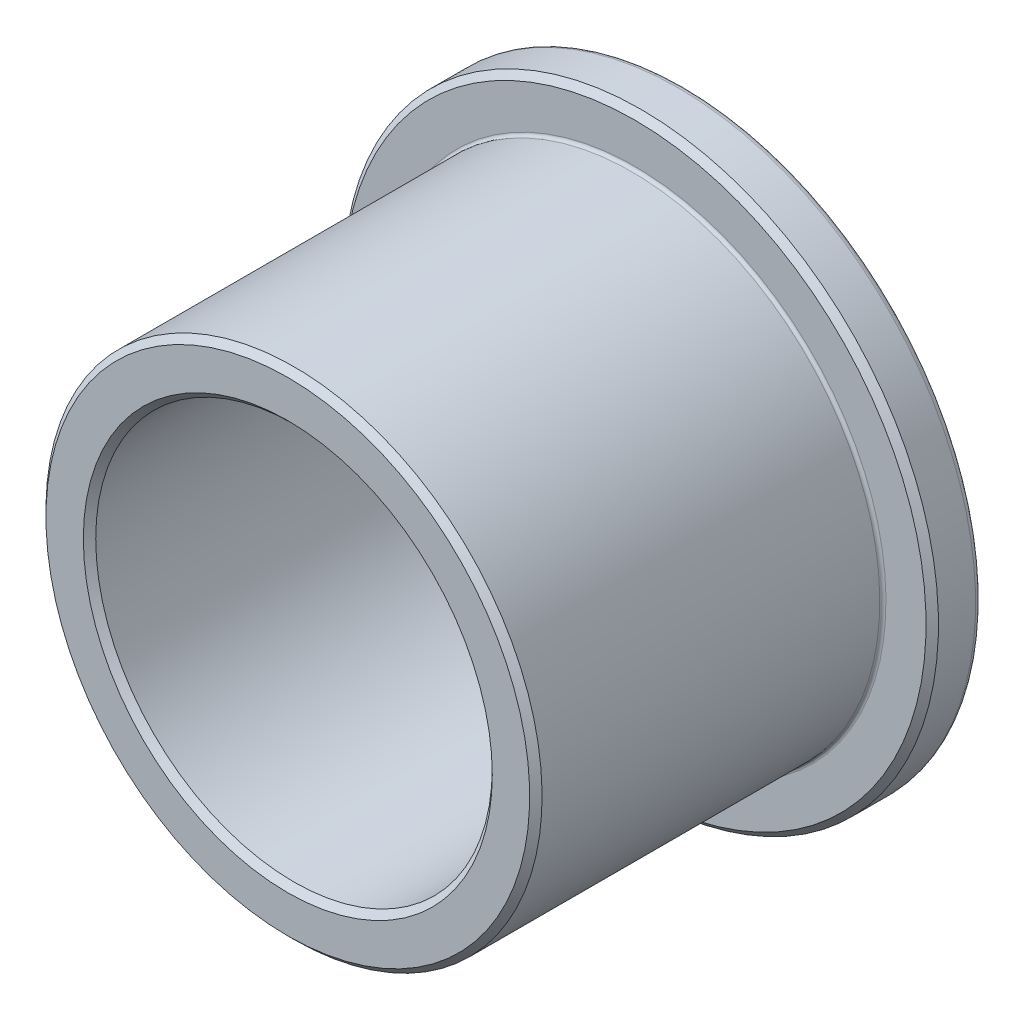
ISO-10303-21;
HEADER;
FILE_DESCRIPTION(('STEP AP214'),'2;1');
FILE_NAME('part.step','',(''),(''),'','','');
FILE_SCHEMA(('AUTOMOTIVE_DESIGN { 1 0 10303 214 1 1 1 1 }'));
ENDSEC;
DATA;
#1=APPLICATION_CONTEXT('core data for automotive mechanical design processes');
#2=APPLICATION_PROTOCOL_DEFINITION('international standard','automotive_design',2000,#1);
#3=PRODUCT_CONTEXT('',#1,'mechanical');
#4=PRODUCT('Part','Part','',(#3));
#5=PRODUCT_RELATED_PRODUCT_CATEGORY('part','',(#4));
#6=PRODUCT_DEFINITION_FORMATION('','',#4);
#7=PRODUCT_DEFINITION_CONTEXT('part definition',#1,'design');
#8=PRODUCT_DEFINITION('design','',#6,#7);
#9=PRODUCT_DEFINITION_SHAPE('','',#8);
#10=(LENGTH_UNIT() NAMED_UNIT(*) SI_UNIT(.MILLI.,.METRE.));
#11=(NAMED_UNIT(*) PLANE_ANGLE_UNIT() SI_UNIT($,.RADIAN.));
#12=(NAMED_UNIT(*) SI_UNIT($,.STERADIAN.) SOLID_ANGLE_UNIT());
#13=UNCERTAINTY_MEASURE_WITH_UNIT(LENGTH_MEASURE(1.E-05),#10,'distance_accuracy_value','');
#14=(GEOMETRIC_REPRESENTATION_CONTEXT(3) GLOBAL_UNCERTAINTY_ASSIGNED_CONTEXT((#13)) GLOBAL_UNIT_ASSIGNED_CONTEXT((#10,
#11,#12)) REPRESENTATION_CONTEXT('',''));
#15=CARTESIAN_POINT('',(0.,0.,0.));
#16=DIRECTION('',(0.,0.,1.));
#17=DIRECTION('',(1.,0.,0.));
#18=AXIS2_PLACEMENT_3D('',#15,#16,#17);
#19=CARTESIAN_POINT('',(0.,19.05,-12.7));
#20=DIRECTION('',(0.,0.,-1.));
#21=DIRECTION('',(0.,1.,0.));
#22=AXIS2_PLACEMENT_3D('',#19,#20,#21);
#23=PLANE('',#22);
#24=CARTESIAN_POINT('',(0.,0.,-12.7));
#25=DIRECTION('',(0.,0.,-1.));
#26=DIRECTION('',(0.,1.,0.));
#27=AXIS2_PLACEMENT_3D('',#24,#25,#26);
#28=CIRCLE('',#27,18.653125);
#29=CARTESIAN_POINT('',(0.,18.653125,-12.7));
#30=VERTEX_POINT('',#29);
#31=EDGE_CURVE('E59',#30,#30,#28,.T.);
#32=ORIENTED_EDGE('',*,*,#31,.T.);
#33=EDGE_LOOP('',(#32));
#34=FACE_BOUND('',#33,.T.);
#35=CARTESIAN_POINT('',(0.,0.,-12.7));
#36=DIRECTION('',(0.,0.,-1.));
#37=DIRECTION('',(0.,1.,0.));
#38=AXIS2_PLACEMENT_3D('',#35,#36,#37);
#39=CIRCLE('',#38,12.7);
#40=CARTESIAN_POINT('',(0.,12.7,-12.7));
#41=VERTEX_POINT('',#40);
#42=EDGE_CURVE('E89',#41,#41,#39,.T.);
#43=ORIENTED_EDGE('',*,*,#42,.F.);
#44=EDGE_LOOP('',(#43));
#45=FACE_BOUND('',#44,.T.);
#46=ADVANCED_FACE('F41',(#34,#45),#23,.T.);
#47=CARTESIAN_POINT('',(0.,0.,-12.7));
#48=DIRECTION('',(0.,0.,-1.));
#49=DIRECTION('',(0.,1.,0.));
#50=AXIS2_PLACEMENT_3D('',#47,#48,#49);
#51=CYLINDRICAL_SURFACE('',#50,19.05);
#52=CARTESIAN_POINT('',(0.,0.,-12.303125));
#53=DIRECTION('',(0.,0.,-1.));
#54=DIRECTION('',(0.,1.,0.));
#55=AXIS2_PLACEMENT_3D('',#52,#53,#54);
#56=CIRCLE('',#55,19.05);
#57=CARTESIAN_POINT('',(0.,19.05,-12.303125));
#58=VERTEX_POINT('',#57);
#59=EDGE_CURVE('E54',#58,#58,#56,.F.);
#60=ORIENTED_EDGE('',*,*,#59,.T.);
#61=EDGE_LOOP('',(#60));
#62=FACE_BOUND('',#61,.T.);
#63=CARTESIAN_POINT('',(0.,0.,-9.921875));
#64=DIRECTION('',(0.,0.,1.));
#65=DIRECTION('',(0.,-1.,0.));
#66=AXIS2_PLACEMENT_3D('',#63,#64,#65);
#67=CIRCLE('',#66,19.05);
#68=CARTESIAN_POINT('',(0.,19.05,-9.921875));
#69=VERTEX_POINT('',#68);
#70=EDGE_CURVE('E85',#69,#69,#67,.F.);
#71=ORIENTED_EDGE('',*,*,#70,.T.);
#72=EDGE_LOOP('',(#71));
#73=FACE_BOUND('',#72,.T.);
#74=ADVANCED_FACE('F97',(#62,#73),#51,.T.);
#75=CARTESIAN_POINT('',(0.,19.05,-9.525));
#76=DIRECTION('',(0.,0.,1.));
#77=DIRECTION('',(0.,-1.,0.));
#78=AXIS2_PLACEMENT_3D('',#75,#76,#77);
#79=PLANE('',#78);
#80=CARTESIAN_POINT('',(0.,0.,-9.525));
#81=DIRECTION('',(0.,0.,1.));
#82=DIRECTION('',(0.,-1.,0.));
#83=AXIS2_PLACEMENT_3D('',#80,#81,#82);
#84=CIRCLE('',#83,16.0861375);
#85=CARTESIAN_POINT('',(0.,-16.0861375,-9.525));
#86=VERTEX_POINT('',#85);
#87=EDGE_CURVE('E49',#86,#86,#84,.F.);
#88=ORIENTED_EDGE('',*,*,#87,.T.);
#89=EDGE_LOOP('',(#88));
#90=FACE_BOUND('',#89,.T.);
#91=CARTESIAN_POINT('',(0.,0.,-9.525));
#92=DIRECTION('',(0.,0.,1.));
#93=DIRECTION('',(0.,-1.,0.));
#94=AXIS2_PLACEMENT_3D('',#91,#92,#93);
#95=CIRCLE('',#94,18.653125);
#96=CARTESIAN_POINT('',(0.,18.653125,-9.525));
#97=VERTEX_POINT('',#96);
#98=EDGE_CURVE('E81',#97,#97,#95,.T.);
#99=ORIENTED_EDGE('',*,*,#98,.T.);
#100=EDGE_LOOP('',(#99));
#101=FACE_BOUND('',#100,.T.);
#102=ADVANCED_FACE('F104',(#90,#101),#79,.T.);
#103=CARTESIAN_POINT('',(0.,0.,-12.7));
#104=DIRECTION('',(0.,0.,-1.));
#105=DIRECTION('',(0.,1.,0.));
#106=AXIS2_PLACEMENT_3D('',#103,#104,#105);
#107=CYLINDRICAL_SURFACE('',#106,15.8877);
#108=CARTESIAN_POINT('',(0.,0.,-9.3265625));
#109=DIRECTION('',(0.,0.,1.));
#110=DIRECTION('',(0.,-1.,0.));
#111=AXIS2_PLACEMENT_3D('',#108,#109,#110);
#112=CIRCLE('',#111,15.8877);
#113=CARTESIAN_POINT('',(0.,-15.8877,-9.3265625));
#114=VERTEX_POINT('',#113);
#115=EDGE_CURVE('E10',#114,#114,#112,.T.);
#116=ORIENTED_EDGE('',*,*,#115,.T.);
#117=EDGE_LOOP('',(#116));
#118=FACE_BOUND('',#117,.T.);
#119=CARTESIAN_POINT('',(0.,0.,12.303125));
#120=DIRECTION('',(0.,0.,1.));
#121=DIRECTION('',(0.,-1.,0.));
#122=AXIS2_PLACEMENT_3D('',#119,#120,#121);
#123=CIRCLE('',#122,15.8877);
#124=CARTESIAN_POINT('',(0.,-15.8877,12.303125));
#125=VERTEX_POINT('',#124);
#126=EDGE_CURVE('E77',#125,#125,#123,.F.);
#127=ORIENTED_EDGE('',*,*,#126,.T.);
#128=EDGE_LOOP('',(#127));
#129=FACE_BOUND('',#128,.T.);
#130=ADVANCED_FACE('F139',(#118,#129),#107,.T.);
#131=CARTESIAN_POINT('',(0.,15.8877,12.7));
#132=DIRECTION('',(0.,0.,1.));
#133=DIRECTION('',(0.,-1.,0.));
#134=AXIS2_PLACEMENT_3D('',#131,#132,#133);
#135=PLANE('',#134);
#136=CARTESIAN_POINT('',(0.,0.,12.7));
#137=DIRECTION('',(0.,0.,1.));
#138=DIRECTION('',(0.,-1.,0.));
#139=AXIS2_PLACEMENT_3D('',#136,#137,#138);
#140=CIRCLE('',#139,15.490825);
#141=CARTESIAN_POINT('',(0.,-15.490825,12.7));
#142=VERTEX_POINT('',#141);
#143=EDGE_CURVE('E69',#142,#142,#140,.T.);
#144=ORIENTED_EDGE('',*,*,#143,.T.);
#145=EDGE_LOOP('',(#144));
#146=FACE_BOUND('',#145,.T.);
#147=CARTESIAN_POINT('',(0.,0.,12.7));
#148=DIRECTION('',(0.,0.,1.));
#149=DIRECTION('',(0.,-1.,0.));
#150=AXIS2_PLACEMENT_3D('',#147,#148,#149);
#151=CIRCLE('',#150,13.096875);
#152=CARTESIAN_POINT('',(0.,-13.096875,12.7));
#153=VERTEX_POINT('',#152);
#154=EDGE_CURVE('E73',#153,#153,#151,.F.);
#155=ORIENTED_EDGE('',*,*,#154,.T.);
#156=EDGE_LOOP('',(#155));
#157=FACE_BOUND('',#156,.T.);
#158=ADVANCED_FACE('F142',(#146,#157),#135,.T.);
#159=CARTESIAN_POINT('',(0.,0.,-12.7));
#160=DIRECTION('',(0.,0.,-1.));
#161=DIRECTION('',(0.,1.,0.));
#162=AXIS2_PLACEMENT_3D('',#159,#160,#161);
#163=CYLINDRICAL_SURFACE('',#162,12.7);
#164=CARTESIAN_POINT('',(0.,0.,12.303125));
#165=DIRECTION('',(0.,0.,1.));
#166=DIRECTION('',(0.,-1.,0.));
#167=AXIS2_PLACEMENT_3D('',#164,#165,#166);
#168=CIRCLE('',#167,12.7);
#169=CARTESIAN_POINT('',(0.,-12.7,12.303125));
#170=VERTEX_POINT('',#169);
#171=EDGE_CURVE('E65',#170,#170,#168,.T.);
#172=ORIENTED_EDGE('',*,*,#171,.T.);
#173=EDGE_LOOP('',(#172));
#174=FACE_BOUND('',#173,.T.);
#175=ORIENTED_EDGE('',*,*,#42,.T.);
#176=EDGE_LOOP('',(#175));
#177=FACE_BOUND('',#176,.T.);
#178=ADVANCED_FACE('F94',(#174,#177),#163,.F.);
#179=CARTESIAN_POINT('',(0.,0.,-9.921875));
#180=DIRECTION('',(0.,0.,-1.));
#181=DIRECTION('',(0.,1.,0.));
#182=AXIS2_PLACEMENT_3D('',#179,#180,#181);
#183=CONICAL_SURFACE('',#182,19.05,0.785398163397453);
#184=CARTESIAN_POINT('',(0.,18.653125,-9.525));
#185=CARTESIAN_POINT('',(0.,18.6572591145833,-9.52913411458333));
#186=CARTESIAN_POINT('',(0.,18.6613932291667,-9.53326822916666));
#187=CARTESIAN_POINT('',(0.,18.6696614583333,-9.54153645833333));
#188=CARTESIAN_POINT('',(0.,18.6737955729167,-9.54567057291666));
#189=CARTESIAN_POINT('',(0.,18.6820638020833,-9.55393880208333));
#190=CARTESIAN_POINT('',(0.,18.6861979166667,-9.55807291666667));
#191=CARTESIAN_POINT('',(0.,18.6944661458333,-9.56634114583333));
#192=CARTESIAN_POINT('',(0.,18.6986002604167,-9.57047526041666));
#193=CARTESIAN_POINT('',(0.,18.7068684895833,-9.57874348958333));
#194=CARTESIAN_POINT('',(0.,18.7110026041667,-9.58287760416667));
#195=CARTESIAN_POINT('',(0.,18.7192708333333,-9.59114583333333));
#196=CARTESIAN_POINT('',(0.,18.7234049479167,-9.59527994791667));
#197=CARTESIAN_POINT('',(0.,18.7316731770833,-9.60354817708333));
#198=CARTESIAN_POINT('',(0.,18.7358072916667,-9.60768229166667));
#199=CARTESIAN_POINT('',(0.,18.7440755208333,-9.61595052083333));
#200=CARTESIAN_POINT('',(0.,18.7482096354167,-9.62008463541667));
#201=CARTESIAN_POINT('',(0.,18.7564778645833,-9.62835286458333));
#202=CARTESIAN_POINT('',(0.,18.7606119791667,-9.63248697916667));
#203=CARTESIAN_POINT('',(0.,18.7688802083333,-9.64075520833333));
#204=CARTESIAN_POINT('',(0.,18.7730143229167,-9.64488932291667));
#205=CARTESIAN_POINT('',(0.,18.7812825520833,-9.65315755208333));
#206=CARTESIAN_POINT('',(0.,18.7854166666667,-9.65729166666666));
#207=CARTESIAN_POINT('',(0.,18.7936848958333,-9.66555989583333));
#208=CARTESIAN_POINT('',(0.,18.7978190104167,-9.66969401041666));
#209=CARTESIAN_POINT('',(0.,18.8060872395833,-9.67796223958333));
#210=CARTESIAN_POINT('',(0.,18.8102213541667,-9.68209635416666));
#211=CARTESIAN_POINT('',(0.,18.8184895833333,-9.69036458333333));
#212=CARTESIAN_POINT('',(0.,18.8226236979167,-9.69449869791666));
#213=CARTESIAN_POINT('',(0.,18.8308919270833,-9.70276692708333));
#214=CARTESIAN_POINT('',(0.,18.8350260416667,-9.70690104166667));
#215=CARTESIAN_POINT('',(0.,18.8432942708333,-9.71516927083333));
#216=CARTESIAN_POINT('',(0.,18.8474283854167,-9.71930338541666));
#217=CARTESIAN_POINT('',(0.,18.8556966145833,-9.72757161458333));
#218=CARTESIAN_POINT('',(0.,18.8598307291667,-9.73170572916666));
#219=CARTESIAN_POINT('',(0.,18.8680989583333,-9.73997395833333));
#220=CARTESIAN_POINT('',(0.,18.8722330729167,-9.74410807291667));
#221=CARTESIAN_POINT('',(0.,18.8805013020833,-9.75237630208333));
#222=CARTESIAN_POINT('',(0.,18.8846354166667,-9.75651041666667));
#223=CARTESIAN_POINT('',(0.,18.8929036458333,-9.76477864583333));
#224=CARTESIAN_POINT('',(0.,18.8970377604167,-9.76891276041667));
#225=CARTESIAN_POINT('',(0.,18.9053059895833,-9.77718098958333));
#226=CARTESIAN_POINT('',(0.,18.9094401041667,-9.78131510416667));
#227=CARTESIAN_POINT('',(0.,18.9177083333333,-9.78958333333333));
#228=CARTESIAN_POINT('',(0.,18.9218424479167,-9.79371744791667));
#229=CARTESIAN_POINT('',(0.,18.9301106770833,-9.80198567708333));
#230=CARTESIAN_POINT('',(0.,18.9342447916667,-9.80611979166667));
#231=CARTESIAN_POINT('',(0.,18.9425130208333,-9.81438802083333));
#232=CARTESIAN_POINT('',(0.,18.9466471354167,-9.81852213541667));
#233=CARTESIAN_POINT('',(0.,18.9549153645833,-9.82679036458333));
#234=CARTESIAN_POINT('',(0.,18.9590494791667,-9.83092447916667));
#235=CARTESIAN_POINT('',(0.,18.9673177083333,-9.83919270833333));
#236=CARTESIAN_POINT('',(0.,18.9714518229167,-9.84332682291667));
#237=CARTESIAN_POINT('',(0.,18.9797200520833,-9.85159505208333));
#238=CARTESIAN_POINT('',(0.,18.9838541666667,-9.85572916666666));
#239=CARTESIAN_POINT('',(0.,18.9921223958333,-9.86399739583333));
#240=CARTESIAN_POINT('',(0.,18.9962565104167,-9.86813151041667));
#241=CARTESIAN_POINT('',(0.,19.0045247395833,-9.87639973958333));
#242=CARTESIAN_POINT('',(0.,19.0086588541667,-9.88053385416666));
#243=CARTESIAN_POINT('',(0.,19.0169270833333,-9.88880208333333));
#244=CARTESIAN_POINT('',(0.,19.0210611979167,-9.89293619791667));
#245=CARTESIAN_POINT('',(0.,19.0293294270833,-9.90120442708333));
#246=CARTESIAN_POINT('',(0.,19.0334635416667,-9.90533854166667));
#247=CARTESIAN_POINT('',(0.,19.0417317708333,-9.91360677083333));
#248=CARTESIAN_POINT('',(0.,19.0458658854167,-9.91774088541667));
#249=CARTESIAN_POINT('',(0.,19.05,-9.921875));
#250=B_SPLINE_CURVE_WITH_KNOTS('',3,(#184,#185,#186,#187,#188,#189,#190,#191,#192,#193,#194,
#195,#196,#197,#198,#199,#200,#201,#202,#203,#204,#205,#206,#207,#208,#209,#210,#211,#212,#213,
#214,#215,#216,#217,#218,#219,#220,#221,#222,#223,#224,#225,#226,#227,#228,#229,#230,#231,#232,
#233,#234,#235,#236,#237,#238,#239,#240,#241,#242,#243,#244,#245,#246,#247,#248,#249),
.UNSPECIFIED.,.F.,.F.,(4,2,2,2,2,2,2,2,2,2,2,2,2,2,2,2,2,2,2,2,2,2,2,2,2,2,2,2,2,2,2,2,4),(0.,
0.0175395627364628,0.0350791254729256,0.0526186882093908,0.0701582509458524,0.0876978136823176,
0.10523737641878,0.122776939155242,0.140316501891707,0.15785606462817,0.175395627364632,
0.192935190101097,0.21047475283756,0.228014315574024,0.245553878310486,0.263093441046949,
0.280633003783413,0.298172566519876,0.315712129256339,0.333251691992804,0.350791254729266,
0.368330817465731,0.385870380202194,0.403409942938655,0.420949505675121,0.438489068411583,
0.456028631148045,0.47356819388451,0.491107756620973,0.508647319357437,0.5261868820939,
0.543726444830362,0.561266007566828),.UNSPECIFIED.);
#251=EDGE_CURVE('BSEAM109',#97,#69,#250,.T.);
#252=ORIENTED_EDGE('',*,*,#98,.F.);
#253=ORIENTED_EDGE('',*,*,#70,.F.);
#254=ORIENTED_EDGE('',*,*,#251,.T.);
#255=ORIENTED_EDGE('',*,*,#251,.F.);
#256=EDGE_LOOP('',(#252,#254,#253,#255));
#257=FACE_BOUND('',#256,.T.);
#258=ADVANCED_FACE('F109',(#257),#183,.T.);
#259=CARTESIAN_POINT('',(0.,0.,12.303125));
#260=DIRECTION('',(0.,0.,-1.));
#261=DIRECTION('',(0.,1.,0.));
#262=AXIS2_PLACEMENT_3D('',#259,#260,#261);
#263=CONICAL_SURFACE('',#262,15.8877,0.785398163397453);
#264=ORIENTED_EDGE('',*,*,#143,.F.);
#265=EDGE_LOOP('',(#264));
#266=FACE_BOUND('',#265,.T.);
#267=ORIENTED_EDGE('',*,*,#126,.F.);
#268=EDGE_LOOP('',(#267));
#269=FACE_BOUND('',#268,.T.);
#270=ADVANCED_FACE('F112',(#266,#269),#263,.T.);
#271=CARTESIAN_POINT('',(0.,0.,12.7));
#272=DIRECTION('',(0.,0.,1.));
#273=DIRECTION('',(0.,-1.,0.));
#274=AXIS2_PLACEMENT_3D('',#271,#272,#273);
#275=CONICAL_SURFACE('',#274,13.096875,0.785398163397442);
#276=ORIENTED_EDGE('',*,*,#171,.F.);
#277=EDGE_LOOP('',(#276));
#278=FACE_BOUND('',#277,.T.);
#279=ORIENTED_EDGE('',*,*,#154,.F.);
#280=EDGE_LOOP('',(#279));
#281=FACE_BOUND('',#280,.T.);
#282=ADVANCED_FACE('F116',(#278,#281),#275,.F.);
#283=CARTESIAN_POINT('',(0.,0.,-12.303125));
#284=DIRECTION('',(0.,0.,-1.));
#285=DIRECTION('',(0.,1.,0.));
#286=AXIS2_PLACEMENT_3D('',#283,#284,#285);
#287=TOROIDAL_SURFACE('',#286,18.653125,0.396875);
#288=ORIENTED_EDGE('',*,*,#59,.F.);
#289=EDGE_LOOP('',(#288));
#290=FACE_BOUND('',#289,.T.);
#291=ORIENTED_EDGE('',*,*,#31,.F.);
#292=EDGE_LOOP('',(#291));
#293=FACE_BOUND('',#292,.T.);
#294=ADVANCED_FACE('F118',(#290,#293),#287,.T.);
#295=CARTESIAN_POINT('',(0.,0.,-9.3265625));
#296=DIRECTION('',(0.,0.,1.));
#297=DIRECTION('',(0.,-1.,0.));
#298=AXIS2_PLACEMENT_3D('',#295,#296,#297);
#299=TOROIDAL_SURFACE('',#298,16.0861375,0.1984375);
#300=ORIENTED_EDGE('',*,*,#115,.F.);
#301=EDGE_LOOP('',(#300));
#302=FACE_BOUND('',#301,.T.);
#303=ORIENTED_EDGE('',*,*,#87,.F.);
#304=EDGE_LOOP('',(#303));
#305=FACE_BOUND('',#304,.T.);
#306=ADVANCED_FACE('F43',(#302,#305),#299,.F.);
#307=CLOSED_SHELL('',(#46,#74,#102,#130,#158,#178,#258,#270,#282,#294,#306));
#308=MANIFOLD_SOLID_BREP('B2',#307);
#309=ADVANCED_BREP_SHAPE_REPRESENTATION('',(#18,#308),#14);
#310=SHAPE_DEFINITION_REPRESENTATION(#9,#309);
ENDSEC;
END-ISO-10303-21;
